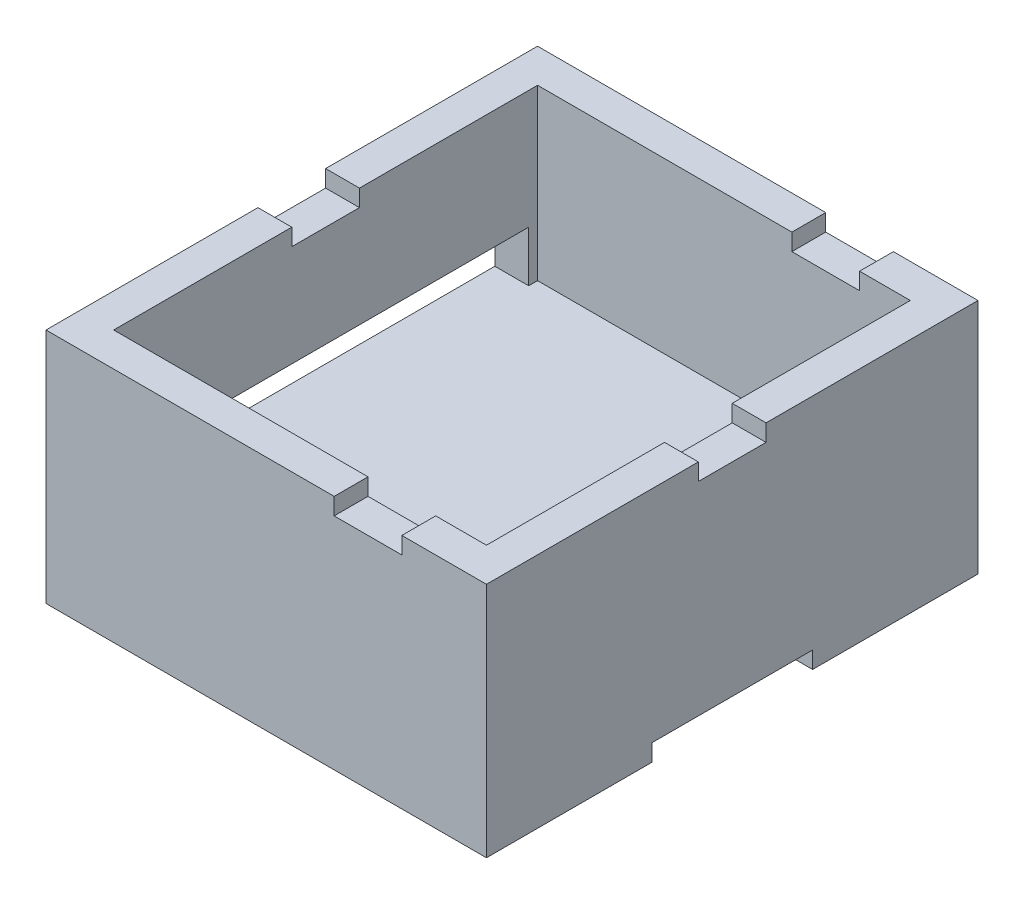
ISO-10303-21;
HEADER;
FILE_DESCRIPTION(('STEP AP214'),'2;1');
FILE_NAME('part.step','',(''),(''),'','','');
FILE_SCHEMA(('AUTOMOTIVE_DESIGN { 1 0 10303 214 1 1 1 1 }'));
ENDSEC;
DATA;
#1=APPLICATION_CONTEXT('core data for automotive mechanical design processes');
#2=APPLICATION_PROTOCOL_DEFINITION('international standard','automotive_design',2000,#1);
#3=PRODUCT_CONTEXT('',#1,'mechanical');
#4=PRODUCT('Part','Part','',(#3));
#5=PRODUCT_RELATED_PRODUCT_CATEGORY('part','',(#4));
#6=PRODUCT_DEFINITION_FORMATION('','',#4);
#7=PRODUCT_DEFINITION_CONTEXT('part definition',#1,'design');
#8=PRODUCT_DEFINITION('design','',#6,#7);
#9=PRODUCT_DEFINITION_SHAPE('','',#8);
#10=(LENGTH_UNIT() NAMED_UNIT(*) SI_UNIT(.MILLI.,.METRE.));
#11=(NAMED_UNIT(*) PLANE_ANGLE_UNIT() SI_UNIT($,.RADIAN.));
#12=(NAMED_UNIT(*) SI_UNIT($,.STERADIAN.) SOLID_ANGLE_UNIT());
#13=UNCERTAINTY_MEASURE_WITH_UNIT(LENGTH_MEASURE(1.E-05),#10,'distance_accuracy_value','');
#14=(GEOMETRIC_REPRESENTATION_CONTEXT(3) GLOBAL_UNCERTAINTY_ASSIGNED_CONTEXT((#13)) GLOBAL_UNIT_ASSIGNED_CONTEXT((#10,
#11,#12)) REPRESENTATION_CONTEXT('',''));
#15=CARTESIAN_POINT('',(0.,0.,0.));
#16=DIRECTION('',(0.,0.,1.));
#17=DIRECTION('',(1.,0.,0.));
#18=AXIS2_PLACEMENT_3D('',#15,#16,#17);
#19=CARTESIAN_POINT('',(0.,0.,0.));
#20=DIRECTION('',(0.,1.,0.));
#21=DIRECTION('',(0.,0.,1.));
#22=AXIS2_PLACEMENT_3D('',#19,#20,#21);
#23=PLANE('',#22);
#24=CARTESIAN_POINT('',(16.53,0.,-2.5));
#25=DIRECTION('',(0.,1.,0.));
#26=DIRECTION('',(0.,0.,1.));
#27=AXIS2_PLACEMENT_3D('',#24,#25,#26);
#28=CIRCLE('',#27,1.5);
#29=CARTESIAN_POINT('',(16.53,0.,-0.999999999999999));
#30=VERTEX_POINT('',#29);
#31=EDGE_CURVE('E497',#30,#30,#28,.T.);
#32=ORIENTED_EDGE('',*,*,#31,.T.);
#33=EDGE_LOOP('',(#32));
#34=FACE_BOUND('',#33,.T.);
#35=DIRECTION('',(0.,0.,-1.));
#36=VECTOR('',#35,1.);
#37=CARTESIAN_POINT('',(-3.5,0.,-25.55));
#38=LINE('',#37,#36);
#39=CARTESIAN_POINT('',(-3.5,0.,3.5));
#40=VERTEX_POINT('',#39);
#41=CARTESIAN_POINT('',(-3.5,0.,-6.275));
#42=VERTEX_POINT('',#41);
#43=EDGE_CURVE('E476',#40,#42,#38,.T.);
#44=ORIENTED_EDGE('',*,*,#43,.T.);
#45=DIRECTION('',(-1.,0.,0.));
#46=VECTOR('',#45,1.);
#47=CARTESIAN_POINT('',(-3.5,0.,-6.275));
#48=LINE('',#47,#46);
#49=CARTESIAN_POINT('',(22.53,0.,-6.275));
#50=VERTEX_POINT('',#49);
#51=EDGE_CURVE('E265',#50,#42,#48,.T.);
#52=ORIENTED_EDGE('',*,*,#51,.F.);
#53=DIRECTION('',(0.,0.,1.));
#54=VECTOR('',#53,1.);
#55=CARTESIAN_POINT('',(22.53,0.,3.5));
#56=LINE('',#55,#54);
#57=CARTESIAN_POINT('',(22.53,0.,3.5));
#58=VERTEX_POINT('',#57);
#59=EDGE_CURVE('E467',#50,#58,#56,.T.);
#60=ORIENTED_EDGE('',*,*,#59,.T.);
#61=DIRECTION('',(-1.,0.,0.));
#62=VECTOR('',#61,1.);
#63=CARTESIAN_POINT('',(-3.5,0.,3.5));
#64=LINE('',#63,#62);
#65=EDGE_CURVE('E472',#58,#40,#64,.T.);
#66=ORIENTED_EDGE('',*,*,#65,.T.);
#67=EDGE_LOOP('',(#44,#52,#60,#66));
#68=FACE_BOUND('',#67,.T.);
#69=ADVANCED_FACE('F38',(#34,#68),#23,.F.);
#70=CARTESIAN_POINT('',(0.,14.,0.));
#71=DIRECTION('',(0.,1.,0.));
#72=DIRECTION('',(0.,0.,1.));
#73=AXIS2_PLACEMENT_3D('',#70,#71,#72);
#74=PLANE('',#73);
#75=DIRECTION('',(0.,0.,-1.));
#76=VECTOR('',#75,1.);
#77=CARTESIAN_POINT('',(17.5299999999999,14.,24.45));
#78=LINE('',#77,#76);
#79=CARTESIAN_POINT('',(17.53,14.,3.5));
#80=VERTEX_POINT('',#79);
#81=CARTESIAN_POINT('',(17.53,14.,1.5));
#82=VERTEX_POINT('',#81);
#83=EDGE_CURVE('E297',#80,#82,#78,.T.);
#84=ORIENTED_EDGE('',*,*,#83,.F.);
#85=DIRECTION('',(-1.,0.,0.));
#86=VECTOR('',#85,1.);
#87=CARTESIAN_POINT('',(-3.5,14.,3.5));
#88=LINE('',#87,#86);
#89=CARTESIAN_POINT('',(22.53,14.,3.5));
#90=VERTEX_POINT('',#89);
#91=EDGE_CURVE('E454',#90,#80,#88,.T.);
#92=ORIENTED_EDGE('',*,*,#91,.F.);
#93=DIRECTION('',(0.,0.,1.));
#94=VECTOR('',#93,1.);
#95=CARTESIAN_POINT('',(22.53,14.,3.5));
#96=LINE('',#95,#94);
#97=CARTESIAN_POINT('',(22.53,14.,-9.025));
#98=VERTEX_POINT('',#97);
#99=EDGE_CURVE('E447',#98,#90,#96,.T.);
#100=ORIENTED_EDGE('',*,*,#99,.F.);
#101=DIRECTION('',(-1.,0.,0.));
#102=VECTOR('',#101,1.);
#103=CARTESIAN_POINT('',(46.5,14.,-9.025));
#104=LINE('',#103,#102);
#105=CARTESIAN_POINT('',(20.53,14.,-9.025));
#106=VERTEX_POINT('',#105);
#107=EDGE_CURVE('E346',#98,#106,#104,.T.);
#108=ORIENTED_EDGE('',*,*,#107,.T.);
#109=DIRECTION('',(0.,0.,1.));
#110=VECTOR('',#109,1.);
#111=CARTESIAN_POINT('',(20.53,14.,1.5));
#112=LINE('',#111,#110);
#113=CARTESIAN_POINT('',(20.53,14.,1.5));
#114=VERTEX_POINT('',#113);
#115=EDGE_CURVE('E417',#106,#114,#112,.T.);
#116=ORIENTED_EDGE('',*,*,#115,.T.);
#117=DIRECTION('',(-1.,0.,0.));
#118=VECTOR('',#117,1.);
#119=CARTESIAN_POINT('',(-1.5,14.,1.5));
#120=LINE('',#119,#118);
#121=EDGE_CURVE('E423',#114,#82,#120,.T.);
#122=ORIENTED_EDGE('',*,*,#121,.T.);
#123=EDGE_LOOP('',(#84,#92,#100,#108,#116,#122));
#124=FACE_BOUND('',#123,.T.);
#125=ADVANCED_FACE('F667',(#124),#74,.T.);
#126=CARTESIAN_POINT('',(17.53,14.,-23.55));
#127=VERTEX_POINT('',#126);
#128=CARTESIAN_POINT('',(17.53,14.,-25.55));
#129=VERTEX_POINT('',#128);
#130=EDGE_CURVE('E294',#127,#129,#78,.T.);
#131=ORIENTED_EDGE('',*,*,#130,.F.);
#132=DIRECTION('',(1.,0.,0.));
#133=VECTOR('',#132,1.);
#134=CARTESIAN_POINT('',(20.53,14.,-23.55));
#135=LINE('',#134,#133);
#136=CARTESIAN_POINT('',(20.53,14.,-23.55));
#137=VERTEX_POINT('',#136);
#138=EDGE_CURVE('E412',#127,#137,#135,.T.);
#139=ORIENTED_EDGE('',*,*,#138,.T.);
#140=CARTESIAN_POINT('',(20.53,14.,-13.025));
#141=VERTEX_POINT('',#140);
#142=EDGE_CURVE('E418',#137,#141,#112,.T.);
#143=ORIENTED_EDGE('',*,*,#142,.T.);
#144=DIRECTION('',(-1.,0.,0.));
#145=VECTOR('',#144,1.);
#146=CARTESIAN_POINT('',(46.5,14.,-13.025));
#147=LINE('',#146,#145);
#148=CARTESIAN_POINT('',(22.53,14.,-13.025));
#149=VERTEX_POINT('',#148);
#150=EDGE_CURVE('E355',#149,#141,#147,.T.);
#151=ORIENTED_EDGE('',*,*,#150,.F.);
#152=CARTESIAN_POINT('',(22.53,14.,-25.55));
#153=VERTEX_POINT('',#152);
#154=EDGE_CURVE('E449',#153,#149,#96,.T.);
#155=ORIENTED_EDGE('',*,*,#154,.F.);
#156=DIRECTION('',(1.,0.,0.));
#157=VECTOR('',#156,1.);
#158=CARTESIAN_POINT('',(22.53,14.,-25.55));
#159=LINE('',#158,#157);
#160=EDGE_CURVE('E448',#129,#153,#159,.T.);
#161=ORIENTED_EDGE('',*,*,#160,.F.);
#162=EDGE_LOOP('',(#131,#139,#143,#151,#155,#161));
#163=FACE_BOUND('',#162,.T.);
#164=ADVANCED_FACE('F652',(#163),#74,.T.);
#165=DIRECTION('',(0.,0.,-1.));
#166=VECTOR('',#165,1.);
#167=CARTESIAN_POINT('',(13.5299999999999,14.,24.45));
#168=LINE('',#167,#166);
#169=CARTESIAN_POINT('',(13.53,14.,3.5));
#170=VERTEX_POINT('',#169);
#171=CARTESIAN_POINT('',(13.53,14.,1.5));
#172=VERTEX_POINT('',#171);
#173=EDGE_CURVE('E298',#170,#172,#168,.T.);
#174=ORIENTED_EDGE('',*,*,#173,.T.);
#175=CARTESIAN_POINT('',(-1.5,14.,1.5));
#176=VERTEX_POINT('',#175);
#177=EDGE_CURVE('E422',#172,#176,#120,.T.);
#178=ORIENTED_EDGE('',*,*,#177,.T.);
#179=DIRECTION('',(0.,0.,-1.));
#180=VECTOR('',#179,1.);
#181=CARTESIAN_POINT('',(-1.5,14.,-23.55));
#182=LINE('',#181,#180);
#183=CARTESIAN_POINT('',(-1.5,14.,-9.025));
#184=VERTEX_POINT('',#183);
#185=EDGE_CURVE('E408',#176,#184,#182,.T.);
#186=ORIENTED_EDGE('',*,*,#185,.T.);
#187=CARTESIAN_POINT('',(-3.5,14.,-9.025));
#188=VERTEX_POINT('',#187);
#189=EDGE_CURVE('E342',#184,#188,#104,.T.);
#190=ORIENTED_EDGE('',*,*,#189,.T.);
#191=DIRECTION('',(0.,0.,-1.));
#192=VECTOR('',#191,1.);
#193=CARTESIAN_POINT('',(-3.5,14.,-25.55));
#194=LINE('',#193,#192);
#195=CARTESIAN_POINT('',(-3.5,14.,3.5));
#196=VERTEX_POINT('',#195);
#197=EDGE_CURVE('E459',#196,#188,#194,.T.);
#198=ORIENTED_EDGE('',*,*,#197,.F.);
#199=EDGE_CURVE('E453',#170,#196,#88,.T.);
#200=ORIENTED_EDGE('',*,*,#199,.F.);
#201=EDGE_LOOP('',(#174,#178,#186,#190,#198,#200));
#202=FACE_BOUND('',#201,.T.);
#203=ADVANCED_FACE('F591',(#202),#74,.T.);
#204=CARTESIAN_POINT('',(0.,4.,0.));
#205=DIRECTION('',(0.,1.,0.));
#206=DIRECTION('',(0.,0.,1.));
#207=AXIS2_PLACEMENT_3D('',#204,#205,#206);
#208=PLANE('',#207);
#209=DIRECTION('',(0.,0.,1.));
#210=VECTOR('',#209,1.);
#211=CARTESIAN_POINT('',(-1.5,4.,-23.55));
#212=LINE('',#211,#210);
#213=CARTESIAN_POINT('',(-1.5,4.,-23.55));
#214=VERTEX_POINT('',#213);
#215=CARTESIAN_POINT('',(-1.5,4.,-23.025));
#216=VERTEX_POINT('',#215);
#217=EDGE_CURVE('E517',#214,#216,#212,.T.);
#218=ORIENTED_EDGE('',*,*,#217,.T.);
#219=DIRECTION('',(-1.,0.,0.));
#220=VECTOR('',#219,1.);
#221=CARTESIAN_POINT('',(1.5,4.,-23.025));
#222=LINE('',#221,#220);
#223=CARTESIAN_POINT('',(-3.5,4.,-23.025));
#224=VERTEX_POINT('',#223);
#225=EDGE_CURVE('E395',#216,#224,#222,.T.);
#226=ORIENTED_EDGE('',*,*,#225,.T.);
#227=DIRECTION('',(0.,0.,1.));
#228=VECTOR('',#227,1.);
#229=CARTESIAN_POINT('',(-3.5,4.,-11.025));
#230=LINE('',#229,#228);
#231=CARTESIAN_POINT('',(-3.5,4.,0.974999999999997));
#232=VERTEX_POINT('',#231);
#233=EDGE_CURVE('E391',#224,#232,#230,.T.);
#234=ORIENTED_EDGE('',*,*,#233,.T.);
#235=DIRECTION('',(-1.,0.,0.));
#236=VECTOR('',#235,1.);
#237=CARTESIAN_POINT('',(1.5,4.,0.974999999999998));
#238=LINE('',#237,#236);
#239=CARTESIAN_POINT('',(-1.5,4.,0.974999999999998));
#240=VERTEX_POINT('',#239);
#241=EDGE_CURVE('E394',#240,#232,#238,.T.);
#242=ORIENTED_EDGE('',*,*,#241,.F.);
#243=CARTESIAN_POINT('',(-1.5,4.,1.5));
#244=VERTEX_POINT('',#243);
#245=EDGE_CURVE('E516',#240,#244,#212,.T.);
#246=ORIENTED_EDGE('',*,*,#245,.T.);
#247=DIRECTION('',(1.,0.,0.));
#248=VECTOR('',#247,1.);
#249=CARTESIAN_POINT('',(-1.5,4.,1.5));
#250=LINE('',#249,#248);
#251=CARTESIAN_POINT('',(20.53,4.,1.5));
#252=VERTEX_POINT('',#251);
#253=EDGE_CURVE('E521',#244,#252,#250,.T.);
#254=ORIENTED_EDGE('',*,*,#253,.T.);
#255=DIRECTION('',(0.,0.,-1.));
#256=VECTOR('',#255,1.);
#257=CARTESIAN_POINT('',(20.53,4.,1.5));
#258=LINE('',#257,#256);
#259=CARTESIAN_POINT('',(20.53,4.,-23.55));
#260=VERTEX_POINT('',#259);
#261=EDGE_CURVE('E505',#252,#260,#258,.T.);
#262=ORIENTED_EDGE('',*,*,#261,.T.);
#263=DIRECTION('',(-1.,0.,0.));
#264=VECTOR('',#263,1.);
#265=CARTESIAN_POINT('',(20.53,4.,-23.55));
#266=LINE('',#265,#264);
#267=EDGE_CURVE('E512',#260,#214,#266,.T.);
#268=ORIENTED_EDGE('',*,*,#267,.T.);
#269=EDGE_LOOP('',(#218,#226,#234,#242,#246,#254,#262,#268));
#270=FACE_BOUND('',#269,.T.);
#271=CARTESIAN_POINT('',(16.53,4.,-2.5));
#272=DIRECTION('',(0.,1.,0.));
#273=DIRECTION('',(0.,0.,1.));
#274=AXIS2_PLACEMENT_3D('',#271,#272,#273);
#275=CIRCLE('',#274,1.5);
#276=CARTESIAN_POINT('',(16.53,4.,-0.999999999999999));
#277=VERTEX_POINT('',#276);
#278=EDGE_CURVE('E501',#277,#277,#275,.T.);
#279=ORIENTED_EDGE('',*,*,#278,.F.);
#280=EDGE_LOOP('',(#279));
#281=FACE_BOUND('',#280,.T.);
#282=CARTESIAN_POINT('',(16.53,4.,-19.55));
#283=DIRECTION('',(0.,1.,0.));
#284=DIRECTION('',(0.,0.,1.));
#285=AXIS2_PLACEMENT_3D('',#282,#283,#284);
#286=CIRCLE('',#285,1.5);
#287=CARTESIAN_POINT('',(16.53,4.,-18.05));
#288=VERTEX_POINT('',#287);
#289=EDGE_CURVE('E493',#288,#288,#286,.T.);
#290=ORIENTED_EDGE('',*,*,#289,.F.);
#291=EDGE_LOOP('',(#290));
#292=FACE_BOUND('',#291,.T.);
#293=ADVANCED_FACE('F578',(#270,#281,#292),#208,.T.);
#294=CARTESIAN_POINT('',(16.53,0.,-19.55));
#295=DIRECTION('',(0.,1.,0.));
#296=DIRECTION('',(0.,0.,1.));
#297=AXIS2_PLACEMENT_3D('',#294,#295,#296);
#298=CIRCLE('',#297,1.5);
#299=CARTESIAN_POINT('',(16.53,0.,-18.05));
#300=VERTEX_POINT('',#299);
#301=EDGE_CURVE('E483',#300,#300,#298,.T.);
#302=ORIENTED_EDGE('',*,*,#301,.T.);
#303=EDGE_LOOP('',(#302));
#304=FACE_BOUND('',#303,.T.);
#305=CARTESIAN_POINT('',(22.53,0.,-25.55));
#306=VERTEX_POINT('',#305);
#307=CARTESIAN_POINT('',(22.53,0.,-15.775));
#308=VERTEX_POINT('',#307);
#309=EDGE_CURVE('E468',#306,#308,#56,.T.);
#310=ORIENTED_EDGE('',*,*,#309,.T.);
#311=DIRECTION('',(1.,0.,0.));
#312=VECTOR('',#311,1.);
#313=CARTESIAN_POINT('',(22.53,0.,-15.775));
#314=LINE('',#313,#312);
#315=CARTESIAN_POINT('',(-3.5,0.,-15.775));
#316=VERTEX_POINT('',#315);
#317=EDGE_CURVE('E618',#316,#308,#314,.T.);
#318=ORIENTED_EDGE('',*,*,#317,.F.);
#319=CARTESIAN_POINT('',(-3.5,0.,-25.55));
#320=VERTEX_POINT('',#319);
#321=EDGE_CURVE('E271',#316,#320,#38,.T.);
#322=ORIENTED_EDGE('',*,*,#321,.T.);
#323=DIRECTION('',(1.,0.,0.));
#324=VECTOR('',#323,1.);
#325=CARTESIAN_POINT('',(22.53,0.,-25.55));
#326=LINE('',#325,#324);
#327=EDGE_CURVE('E432',#320,#306,#326,.T.);
#328=ORIENTED_EDGE('',*,*,#327,.T.);
#329=EDGE_LOOP('',(#310,#318,#322,#328));
#330=FACE_BOUND('',#329,.T.);
#331=ADVANCED_FACE('F40',(#304,#330),#23,.F.);
#332=CARTESIAN_POINT('',(16.53,4.,-2.5));
#333=DIRECTION('',(0.,-1.,0.));
#334=DIRECTION('',(0.,0.,-1.));
#335=AXIS2_PLACEMENT_3D('',#332,#333,#334);
#336=CYLINDRICAL_SURFACE('',#335,1.5);
#337=ORIENTED_EDGE('',*,*,#278,.T.);
#338=EDGE_LOOP('',(#337));
#339=FACE_BOUND('',#338,.T.);
#340=ORIENTED_EDGE('',*,*,#31,.F.);
#341=EDGE_LOOP('',(#340));
#342=FACE_BOUND('',#341,.T.);
#343=ADVANCED_FACE('F696',(#339,#342),#336,.F.);
#344=CARTESIAN_POINT('',(16.53,4.,-19.55));
#345=DIRECTION('',(0.,-1.,0.));
#346=DIRECTION('',(0.,0.,-1.));
#347=AXIS2_PLACEMENT_3D('',#344,#345,#346);
#348=CYLINDRICAL_SURFACE('',#347,1.5);
#349=ORIENTED_EDGE('',*,*,#289,.T.);
#350=EDGE_LOOP('',(#349));
#351=FACE_BOUND('',#350,.T.);
#352=ORIENTED_EDGE('',*,*,#301,.F.);
#353=EDGE_LOOP('',(#352));
#354=FACE_BOUND('',#353,.T.);
#355=ADVANCED_FACE('F702',(#351,#354),#348,.F.);
#356=CARTESIAN_POINT('',(22.53,14.,-25.55));
#357=DIRECTION('',(0.,0.,-1.));
#358=DIRECTION('',(-1.,0.,0.));
#359=AXIS2_PLACEMENT_3D('',#356,#357,#358);
#360=PLANE('',#359);
#361=DIRECTION('',(0.,-1.,0.));
#362=VECTOR('',#361,1.);
#363=CARTESIAN_POINT('',(17.53,13.,-25.55));
#364=LINE('',#363,#362);
#365=CARTESIAN_POINT('',(17.53,13.,-25.55));
#366=VERTEX_POINT('',#365);
#367=EDGE_CURVE('E281',#129,#366,#364,.T.);
#368=ORIENTED_EDGE('',*,*,#367,.F.);
#369=ORIENTED_EDGE('',*,*,#160,.T.);
#370=DIRECTION('',(0.,-1.,0.));
#371=VECTOR('',#370,1.);
#372=CARTESIAN_POINT('',(22.53,14.,-25.55));
#373=LINE('',#372,#371);
#374=EDGE_CURVE('E463',#153,#306,#373,.T.);
#375=ORIENTED_EDGE('',*,*,#374,.T.);
#376=ORIENTED_EDGE('',*,*,#327,.F.);
#377=DIRECTION('',(0.,-1.,0.));
#378=VECTOR('',#377,1.);
#379=CARTESIAN_POINT('',(-3.5,14.,-25.55));
#380=LINE('',#379,#378);
#381=CARTESIAN_POINT('',(-3.5,14.,-25.55));
#382=VERTEX_POINT('',#381);
#383=EDGE_CURVE('E480',#382,#320,#380,.T.);
#384=ORIENTED_EDGE('',*,*,#383,.F.);
#385=CARTESIAN_POINT('',(13.53,14.,-25.55));
#386=VERTEX_POINT('',#385);
#387=EDGE_CURVE('E443',#382,#386,#159,.T.);
#388=ORIENTED_EDGE('',*,*,#387,.T.);
#389=DIRECTION('',(0.,1.,0.));
#390=VECTOR('',#389,1.);
#391=CARTESIAN_POINT('',(13.53,14.,-25.55));
#392=LINE('',#391,#390);
#393=CARTESIAN_POINT('',(13.53,13.,-25.55));
#394=VERTEX_POINT('',#393);
#395=EDGE_CURVE('E290',#394,#386,#392,.T.);
#396=ORIENTED_EDGE('',*,*,#395,.F.);
#397=DIRECTION('',(-1.,0.,0.));
#398=VECTOR('',#397,1.);
#399=CARTESIAN_POINT('',(13.53,13.,-25.55));
#400=LINE('',#399,#398);
#401=EDGE_CURVE('E285',#366,#394,#400,.T.);
#402=ORIENTED_EDGE('',*,*,#401,.F.);
#403=EDGE_LOOP('',(#368,#369,#375,#376,#384,#388,#396,#402));
#404=FACE_BOUND('',#403,.T.);
#405=ADVANCED_FACE('F641',(#404),#360,.T.);
#406=CARTESIAN_POINT('',(-3.5,14.,-25.55));
#407=DIRECTION('',(-1.,0.,0.));
#408=DIRECTION('',(0.,0.,1.));
#409=AXIS2_PLACEMENT_3D('',#406,#407,#408);
#410=PLANE('',#409);
#411=DIRECTION('',(0.,-1.,0.));
#412=VECTOR('',#411,1.);
#413=CARTESIAN_POINT('',(-3.5,1.,-6.275));
#414=LINE('',#413,#412);
#415=CARTESIAN_POINT('',(-3.5,1.,-6.275));
#416=VERTEX_POINT('',#415);
#417=EDGE_CURVE('E286',#416,#42,#414,.T.);
#418=ORIENTED_EDGE('',*,*,#417,.T.);
#419=ORIENTED_EDGE('',*,*,#43,.F.);
#420=DIRECTION('',(0.,-1.,0.));
#421=VECTOR('',#420,1.);
#422=CARTESIAN_POINT('',(-3.5,14.,3.5));
#423=LINE('',#422,#421);
#424=EDGE_CURVE('E484',#196,#40,#423,.T.);
#425=ORIENTED_EDGE('',*,*,#424,.F.);
#426=ORIENTED_EDGE('',*,*,#197,.T.);
#427=DIRECTION('',(0.,1.,0.));
#428=VECTOR('',#427,1.);
#429=CARTESIAN_POINT('',(-3.5,13.,-9.025));
#430=LINE('',#429,#428);
#431=CARTESIAN_POINT('',(-3.5,13.,-9.025));
#432=VERTEX_POINT('',#431);
#433=EDGE_CURVE('E338',#432,#188,#430,.T.);
#434=ORIENTED_EDGE('',*,*,#433,.F.);
#435=DIRECTION('',(0.,0.,1.));
#436=VECTOR('',#435,1.);
#437=CARTESIAN_POINT('',(-3.5,13.,-13.025));
#438=LINE('',#437,#436);
#439=CARTESIAN_POINT('',(-3.5,13.,-13.025));
#440=VERTEX_POINT('',#439);
#441=EDGE_CURVE('E334',#440,#432,#438,.T.);
#442=ORIENTED_EDGE('',*,*,#441,.F.);
#443=DIRECTION('',(0.,-1.,0.));
#444=VECTOR('',#443,1.);
#445=CARTESIAN_POINT('',(-3.5,14.,-13.025));
#446=LINE('',#445,#444);
#447=CARTESIAN_POINT('',(-3.5,14.,-13.025));
#448=VERTEX_POINT('',#447);
#449=EDGE_CURVE('E330',#448,#440,#446,.T.);
#450=ORIENTED_EDGE('',*,*,#449,.F.);
#451=EDGE_CURVE('E458',#448,#382,#194,.T.);
#452=ORIENTED_EDGE('',*,*,#451,.T.);
#453=ORIENTED_EDGE('',*,*,#383,.T.);
#454=ORIENTED_EDGE('',*,*,#321,.F.);
#455=DIRECTION('',(0.,-1.,0.));
#456=VECTOR('',#455,1.);
#457=CARTESIAN_POINT('',(-3.5,1.,-15.775));
#458=LINE('',#457,#456);
#459=CARTESIAN_POINT('',(-3.5,1.,-15.775));
#460=VERTEX_POINT('',#459);
#461=EDGE_CURVE('E249',#460,#316,#458,.T.);
#462=ORIENTED_EDGE('',*,*,#461,.F.);
#463=DIRECTION('',(0.,0.,-1.));
#464=VECTOR('',#463,1.);
#465=CARTESIAN_POINT('',(-3.5,1.,-11.025));
#466=LINE('',#465,#464);
#467=EDGE_CURVE('E256',#416,#460,#466,.T.);
#468=ORIENTED_EDGE('',*,*,#467,.F.);
#469=EDGE_LOOP('',(#418,#419,#425,#426,#434,#442,#450,#452,#453,#454,#462,#468));
#470=FACE_BOUND('',#469,.T.);
#471=ORIENTED_EDGE('',*,*,#233,.F.);
#472=DIRECTION('',(0.,-1.,0.));
#473=VECTOR('',#472,1.);
#474=CARTESIAN_POINT('',(-3.5,4.,-23.025));
#475=LINE('',#474,#473);
#476=CARTESIAN_POINT('',(-3.5,7.,-23.025));
#477=VERTEX_POINT('',#476);
#478=EDGE_CURVE('E387',#477,#224,#475,.T.);
#479=ORIENTED_EDGE('',*,*,#478,.F.);
#480=DIRECTION('',(0.,0.,-1.));
#481=VECTOR('',#480,1.);
#482=CARTESIAN_POINT('',(-3.5,7.,-23.025));
#483=LINE('',#482,#481);
#484=CARTESIAN_POINT('',(-3.5,7.,0.974999999999998));
#485=VERTEX_POINT('',#484);
#486=EDGE_CURVE('E383',#485,#477,#483,.T.);
#487=ORIENTED_EDGE('',*,*,#486,.F.);
#488=DIRECTION('',(0.,1.,0.));
#489=VECTOR('',#488,1.);
#490=CARTESIAN_POINT('',(-3.5,7.,0.974999999999998));
#491=LINE('',#490,#489);
#492=EDGE_CURVE('E379',#232,#485,#491,.T.);
#493=ORIENTED_EDGE('',*,*,#492,.F.);
#494=EDGE_LOOP('',(#471,#479,#487,#493));
#495=FACE_BOUND('',#494,.T.);
#496=ADVANCED_FACE('F268',(#470,#495),#410,.T.);
#497=CARTESIAN_POINT('',(-3.5,14.,3.5));
#498=DIRECTION('',(0.,0.,1.));
#499=DIRECTION('',(1.,0.,0.));
#500=AXIS2_PLACEMENT_3D('',#497,#498,#499);
#501=PLANE('',#500);
#502=DIRECTION('',(0.,1.,0.));
#503=VECTOR('',#502,1.);
#504=CARTESIAN_POINT('',(17.53,14.,3.5));
#505=LINE('',#504,#503);
#506=CARTESIAN_POINT('',(17.53,13.,3.5));
#507=VERTEX_POINT('',#506);
#508=EDGE_CURVE('E327',#507,#80,#505,.T.);
#509=ORIENTED_EDGE('',*,*,#508,.F.);
#510=DIRECTION('',(1.,0.,0.));
#511=VECTOR('',#510,1.);
#512=CARTESIAN_POINT('',(-3.5,13.,3.5));
#513=LINE('',#512,#511);
#514=CARTESIAN_POINT('',(13.53,13.,3.5));
#515=VERTEX_POINT('',#514);
#516=EDGE_CURVE('E313',#515,#507,#513,.T.);
#517=ORIENTED_EDGE('',*,*,#516,.F.);
#518=DIRECTION('',(0.,-1.,0.));
#519=VECTOR('',#518,1.);
#520=CARTESIAN_POINT('',(13.53,14.,3.5));
#521=LINE('',#520,#519);
#522=EDGE_CURVE('E320',#170,#515,#521,.T.);
#523=ORIENTED_EDGE('',*,*,#522,.F.);
#524=ORIENTED_EDGE('',*,*,#199,.T.);
#525=ORIENTED_EDGE('',*,*,#424,.T.);
#526=ORIENTED_EDGE('',*,*,#65,.F.);
#527=DIRECTION('',(0.,-1.,0.));
#528=VECTOR('',#527,1.);
#529=CARTESIAN_POINT('',(22.53,14.,3.5));
#530=LINE('',#529,#528);
#531=EDGE_CURVE('E487',#90,#58,#530,.T.);
#532=ORIENTED_EDGE('',*,*,#531,.F.);
#533=ORIENTED_EDGE('',*,*,#91,.T.);
#534=EDGE_LOOP('',(#509,#517,#523,#524,#525,#526,#532,#533));
#535=FACE_BOUND('',#534,.T.);
#536=ADVANCED_FACE('F670',(#535),#501,.T.);
#537=CARTESIAN_POINT('',(22.53,14.,3.5));
#538=DIRECTION('',(1.,0.,0.));
#539=DIRECTION('',(0.,0.,-1.));
#540=AXIS2_PLACEMENT_3D('',#537,#538,#539);
#541=PLANE('',#540);
#542=DIRECTION('',(0.,-1.,0.));
#543=VECTOR('',#542,1.);
#544=CARTESIAN_POINT('',(22.53,1.,-6.275));
#545=LINE('',#544,#543);
#546=CARTESIAN_POINT('',(22.53,1.,-6.275));
#547=VERTEX_POINT('',#546);
#548=EDGE_CURVE('E276',#547,#50,#545,.T.);
#549=ORIENTED_EDGE('',*,*,#548,.F.);
#550=DIRECTION('',(0.,0.,1.));
#551=VECTOR('',#550,1.);
#552=CARTESIAN_POINT('',(22.53,1.,-6.275));
#553=LINE('',#552,#551);
#554=CARTESIAN_POINT('',(22.53,0.999999999999999,-15.775));
#555=VERTEX_POINT('',#554);
#556=EDGE_CURVE('E255',#555,#547,#553,.T.);
#557=ORIENTED_EDGE('',*,*,#556,.F.);
#558=DIRECTION('',(0.,-1.,0.));
#559=VECTOR('',#558,1.);
#560=CARTESIAN_POINT('',(22.53,1.,-15.775));
#561=LINE('',#560,#559);
#562=EDGE_CURVE('E252',#555,#308,#561,.T.);
#563=ORIENTED_EDGE('',*,*,#562,.T.);
#564=ORIENTED_EDGE('',*,*,#309,.F.);
#565=ORIENTED_EDGE('',*,*,#374,.F.);
#566=ORIENTED_EDGE('',*,*,#154,.T.);
#567=DIRECTION('',(0.,1.,0.));
#568=VECTOR('',#567,1.);
#569=CARTESIAN_POINT('',(22.53,14.,-13.025));
#570=LINE('',#569,#568);
#571=CARTESIAN_POINT('',(22.53,13.,-13.025));
#572=VERTEX_POINT('',#571);
#573=EDGE_CURVE('E362',#572,#149,#570,.T.);
#574=ORIENTED_EDGE('',*,*,#573,.F.);
#575=DIRECTION('',(0.,0.,-1.));
#576=VECTOR('',#575,1.);
#577=CARTESIAN_POINT('',(22.53,13.,3.5));
#578=LINE('',#577,#576);
#579=CARTESIAN_POINT('',(22.53,13.,-9.025));
#580=VERTEX_POINT('',#579);
#581=EDGE_CURVE('E369',#580,#572,#578,.T.);
#582=ORIENTED_EDGE('',*,*,#581,.F.);
#583=DIRECTION('',(0.,-1.,0.));
#584=VECTOR('',#583,1.);
#585=CARTESIAN_POINT('',(22.53,14.,-9.025));
#586=LINE('',#585,#584);
#587=EDGE_CURVE('E376',#98,#580,#586,.T.);
#588=ORIENTED_EDGE('',*,*,#587,.F.);
#589=ORIENTED_EDGE('',*,*,#99,.T.);
#590=ORIENTED_EDGE('',*,*,#531,.T.);
#591=ORIENTED_EDGE('',*,*,#59,.F.);
#592=EDGE_LOOP('',(#549,#557,#563,#564,#565,#566,#574,#582,#588,#589,#590,#591));
#593=FACE_BOUND('',#592,.T.);
#594=ADVANCED_FACE('F624',(#593),#541,.T.);
#595=CARTESIAN_POINT('',(13.53,14.,-23.55));
#596=VERTEX_POINT('',#595);
#597=EDGE_CURVE('E299',#596,#386,#168,.T.);
#598=ORIENTED_EDGE('',*,*,#597,.T.);
#599=ORIENTED_EDGE('',*,*,#387,.F.);
#600=ORIENTED_EDGE('',*,*,#451,.F.);
#601=CARTESIAN_POINT('',(-1.5,14.,-13.025));
#602=VERTEX_POINT('',#601);
#603=EDGE_CURVE('E341',#602,#448,#147,.T.);
#604=ORIENTED_EDGE('',*,*,#603,.F.);
#605=CARTESIAN_POINT('',(-1.5,14.,-23.55));
#606=VERTEX_POINT('',#605);
#607=EDGE_CURVE('E398',#602,#606,#182,.T.);
#608=ORIENTED_EDGE('',*,*,#607,.T.);
#609=EDGE_CURVE('E413',#606,#596,#135,.T.);
#610=ORIENTED_EDGE('',*,*,#609,.T.);
#611=EDGE_LOOP('',(#598,#599,#600,#604,#608,#610));
#612=FACE_BOUND('',#611,.T.);
#613=ADVANCED_FACE('F561',(#612),#74,.T.);
#614=CARTESIAN_POINT('',(-1.5,14.,-23.55));
#615=DIRECTION('',(-1.,0.,0.));
#616=DIRECTION('',(0.,0.,1.));
#617=AXIS2_PLACEMENT_3D('',#614,#615,#616);
#618=PLANE('',#617);
#619=DIRECTION('',(0.,0.,1.));
#620=VECTOR('',#619,1.);
#621=CARTESIAN_POINT('',(-1.5,13.,-23.55));
#622=LINE('',#621,#620);
#623=CARTESIAN_POINT('',(-1.5,13.,-13.025));
#624=VERTEX_POINT('',#623);
#625=CARTESIAN_POINT('',(-1.5,13.,-9.025));
#626=VERTEX_POINT('',#625);
#627=EDGE_CURVE('E365',#624,#626,#622,.T.);
#628=ORIENTED_EDGE('',*,*,#627,.T.);
#629=DIRECTION('',(0.,1.,0.));
#630=VECTOR('',#629,1.);
#631=CARTESIAN_POINT('',(-1.5,14.,-9.025));
#632=LINE('',#631,#630);
#633=EDGE_CURVE('E372',#626,#184,#632,.T.);
#634=ORIENTED_EDGE('',*,*,#633,.T.);
#635=ORIENTED_EDGE('',*,*,#185,.F.);
#636=DIRECTION('',(0.,-1.,0.));
#637=VECTOR('',#636,1.);
#638=CARTESIAN_POINT('',(-1.5,14.,1.5));
#639=LINE('',#638,#637);
#640=EDGE_CURVE('E428',#176,#244,#639,.T.);
#641=ORIENTED_EDGE('',*,*,#640,.T.);
#642=ORIENTED_EDGE('',*,*,#245,.F.);
#643=DIRECTION('',(0.,1.,0.));
#644=VECTOR('',#643,1.);
#645=CARTESIAN_POINT('',(-1.5,14.,0.974999999999997));
#646=LINE('',#645,#644);
#647=CARTESIAN_POINT('',(-1.5,7.,0.974999999999997));
#648=VERTEX_POINT('',#647);
#649=EDGE_CURVE('E525',#240,#648,#646,.T.);
#650=ORIENTED_EDGE('',*,*,#649,.T.);
#651=DIRECTION('',(0.,0.,-1.));
#652=VECTOR('',#651,1.);
#653=CARTESIAN_POINT('',(-1.5,7.,-23.55));
#654=LINE('',#653,#652);
#655=CARTESIAN_POINT('',(-1.5,7.,-23.025));
#656=VERTEX_POINT('',#655);
#657=EDGE_CURVE('E529',#648,#656,#654,.T.);
#658=ORIENTED_EDGE('',*,*,#657,.T.);
#659=DIRECTION('',(0.,-1.,0.));
#660=VECTOR('',#659,1.);
#661=CARTESIAN_POINT('',(-1.5,14.,-23.025));
#662=LINE('',#661,#660);
#663=EDGE_CURVE('E533',#656,#216,#662,.T.);
#664=ORIENTED_EDGE('',*,*,#663,.T.);
#665=ORIENTED_EDGE('',*,*,#217,.F.);
#666=DIRECTION('',(0.,-1.,0.));
#667=VECTOR('',#666,1.);
#668=CARTESIAN_POINT('',(-1.5,14.,-23.55));
#669=LINE('',#668,#667);
#670=EDGE_CURVE('E427',#606,#214,#669,.T.);
#671=ORIENTED_EDGE('',*,*,#670,.F.);
#672=ORIENTED_EDGE('',*,*,#607,.F.);
#673=DIRECTION('',(0.,-1.,0.));
#674=VECTOR('',#673,1.);
#675=CARTESIAN_POINT('',(-1.5,14.,-13.025));
#676=LINE('',#675,#674);
#677=EDGE_CURVE('E358',#602,#624,#676,.T.);
#678=ORIENTED_EDGE('',*,*,#677,.T.);
#679=EDGE_LOOP('',(#628,#634,#635,#641,#642,#650,#658,#664,#665,#671,#672,#678));
#680=FACE_BOUND('',#679,.T.);
#681=ADVANCED_FACE('F570',(#680),#618,.F.);
#682=CARTESIAN_POINT('',(-1.5,14.,1.5));
#683=DIRECTION('',(0.,0.,1.));
#684=DIRECTION('',(1.,0.,0.));
#685=AXIS2_PLACEMENT_3D('',#682,#683,#684);
#686=PLANE('',#685);
#687=DIRECTION('',(1.,0.,0.));
#688=VECTOR('',#687,1.);
#689=CARTESIAN_POINT('',(-1.5,13.,1.5));
#690=LINE('',#689,#688);
#691=CARTESIAN_POINT('',(13.53,13.,1.5));
#692=VERTEX_POINT('',#691);
#693=CARTESIAN_POINT('',(17.53,13.,1.5));
#694=VERTEX_POINT('',#693);
#695=EDGE_CURVE('E309',#692,#694,#690,.T.);
#696=ORIENTED_EDGE('',*,*,#695,.T.);
#697=DIRECTION('',(0.,1.,0.));
#698=VECTOR('',#697,1.);
#699=CARTESIAN_POINT('',(17.53,14.,1.5));
#700=LINE('',#699,#698);
#701=EDGE_CURVE('E323',#694,#82,#700,.T.);
#702=ORIENTED_EDGE('',*,*,#701,.T.);
#703=ORIENTED_EDGE('',*,*,#121,.F.);
#704=DIRECTION('',(0.,-1.,0.));
#705=VECTOR('',#704,1.);
#706=CARTESIAN_POINT('',(20.53,14.,1.5));
#707=LINE('',#706,#705);
#708=EDGE_CURVE('E433',#114,#252,#707,.T.);
#709=ORIENTED_EDGE('',*,*,#708,.T.);
#710=ORIENTED_EDGE('',*,*,#253,.F.);
#711=ORIENTED_EDGE('',*,*,#640,.F.);
#712=ORIENTED_EDGE('',*,*,#177,.F.);
#713=DIRECTION('',(0.,-1.,0.));
#714=VECTOR('',#713,1.);
#715=CARTESIAN_POINT('',(13.53,14.,1.5));
#716=LINE('',#715,#714);
#717=EDGE_CURVE('E316',#172,#692,#716,.T.);
#718=ORIENTED_EDGE('',*,*,#717,.T.);
#719=EDGE_LOOP('',(#696,#702,#703,#709,#710,#711,#712,#718));
#720=FACE_BOUND('',#719,.T.);
#721=ADVANCED_FACE('F585',(#720),#686,.F.);
#722=CARTESIAN_POINT('',(20.53,14.,1.5));
#723=DIRECTION('',(1.,0.,0.));
#724=DIRECTION('',(0.,0.,-1.));
#725=AXIS2_PLACEMENT_3D('',#722,#723,#724);
#726=PLANE('',#725);
#727=ORIENTED_EDGE('',*,*,#115,.F.);
#728=DIRECTION('',(0.,-1.,0.));
#729=VECTOR('',#728,1.);
#730=CARTESIAN_POINT('',(20.53,14.,-9.025));
#731=LINE('',#730,#729);
#732=CARTESIAN_POINT('',(20.53,13.,-9.025));
#733=VERTEX_POINT('',#732);
#734=EDGE_CURVE('E545',#106,#733,#731,.T.);
#735=ORIENTED_EDGE('',*,*,#734,.T.);
#736=DIRECTION('',(0.,0.,-1.));
#737=VECTOR('',#736,1.);
#738=CARTESIAN_POINT('',(20.53,13.,1.5));
#739=LINE('',#738,#737);
#740=CARTESIAN_POINT('',(20.53,13.,-13.025));
#741=VERTEX_POINT('',#740);
#742=EDGE_CURVE('E541',#733,#741,#739,.T.);
#743=ORIENTED_EDGE('',*,*,#742,.T.);
#744=DIRECTION('',(0.,1.,0.));
#745=VECTOR('',#744,1.);
#746=CARTESIAN_POINT('',(20.53,14.,-13.025));
#747=LINE('',#746,#745);
#748=EDGE_CURVE('E537',#741,#141,#747,.T.);
#749=ORIENTED_EDGE('',*,*,#748,.T.);
#750=ORIENTED_EDGE('',*,*,#142,.F.);
#751=DIRECTION('',(0.,-1.,0.));
#752=VECTOR('',#751,1.);
#753=CARTESIAN_POINT('',(20.53,14.,-23.55));
#754=LINE('',#753,#752);
#755=EDGE_CURVE('E437',#137,#260,#754,.T.);
#756=ORIENTED_EDGE('',*,*,#755,.T.);
#757=ORIENTED_EDGE('',*,*,#261,.F.);
#758=ORIENTED_EDGE('',*,*,#708,.F.);
#759=EDGE_LOOP('',(#727,#735,#743,#749,#750,#756,#757,#758));
#760=FACE_BOUND('',#759,.T.);
#761=ADVANCED_FACE('F576',(#760),#726,.F.);
#762=CARTESIAN_POINT('',(20.53,14.,-23.55));
#763=DIRECTION('',(0.,0.,-1.));
#764=DIRECTION('',(-1.,0.,0.));
#765=AXIS2_PLACEMENT_3D('',#762,#763,#764);
#766=PLANE('',#765);
#767=ORIENTED_EDGE('',*,*,#138,.F.);
#768=DIRECTION('',(0.,-1.,0.));
#769=VECTOR('',#768,1.);
#770=CARTESIAN_POINT('',(17.53,14.,-23.55));
#771=LINE('',#770,#769);
#772=CARTESIAN_POINT('',(17.53,13.,-23.55));
#773=VERTEX_POINT('',#772);
#774=EDGE_CURVE('E11',#127,#773,#771,.T.);
#775=ORIENTED_EDGE('',*,*,#774,.T.);
#776=DIRECTION('',(-1.,0.,0.));
#777=VECTOR('',#776,1.);
#778=CARTESIAN_POINT('',(20.53,13.,-23.55));
#779=LINE('',#778,#777);
#780=CARTESIAN_POINT('',(13.5299999999999,13.,-23.55));
#781=VERTEX_POINT('',#780);
#782=EDGE_CURVE('E549',#773,#781,#779,.T.);
#783=ORIENTED_EDGE('',*,*,#782,.T.);
#784=DIRECTION('',(0.,1.,0.));
#785=VECTOR('',#784,1.);
#786=CARTESIAN_POINT('',(13.53,14.,-23.55));
#787=LINE('',#786,#785);
#788=EDGE_CURVE('E47',#781,#596,#787,.T.);
#789=ORIENTED_EDGE('',*,*,#788,.T.);
#790=ORIENTED_EDGE('',*,*,#609,.F.);
#791=ORIENTED_EDGE('',*,*,#670,.T.);
#792=ORIENTED_EDGE('',*,*,#267,.F.);
#793=ORIENTED_EDGE('',*,*,#755,.F.);
#794=EDGE_LOOP('',(#767,#775,#783,#789,#790,#791,#792,#793));
#795=FACE_BOUND('',#794,.T.);
#796=ADVANCED_FACE('F558',(#795),#766,.F.);
#797=CARTESIAN_POINT('',(1.5,4.,-23.025));
#798=DIRECTION('',(0.,0.,-1.));
#799=DIRECTION('',(-1.,0.,0.));
#800=AXIS2_PLACEMENT_3D('',#797,#798,#799);
#801=PLANE('',#800);
#802=DIRECTION('',(-1.,0.,0.));
#803=VECTOR('',#802,1.);
#804=CARTESIAN_POINT('',(1.5,7.,-23.025));
#805=LINE('',#804,#803);
#806=EDGE_CURVE('E399',#656,#477,#805,.T.);
#807=ORIENTED_EDGE('',*,*,#806,.T.);
#808=ORIENTED_EDGE('',*,*,#478,.T.);
#809=ORIENTED_EDGE('',*,*,#225,.F.);
#810=ORIENTED_EDGE('',*,*,#663,.F.);
#811=EDGE_LOOP('',(#807,#808,#809,#810));
#812=FACE_BOUND('',#811,.T.);
#813=ADVANCED_FACE('F726',(#812),#801,.F.);
#814=CARTESIAN_POINT('',(1.5,7.,-23.025));
#815=DIRECTION('',(0.,1.,0.));
#816=DIRECTION('',(0.,0.,1.));
#817=AXIS2_PLACEMENT_3D('',#814,#815,#816);
#818=PLANE('',#817);
#819=DIRECTION('',(-1.,0.,0.));
#820=VECTOR('',#819,1.);
#821=CARTESIAN_POINT('',(1.5,7.,0.974999999999998));
#822=LINE('',#821,#820);
#823=EDGE_CURVE('E402',#648,#485,#822,.T.);
#824=ORIENTED_EDGE('',*,*,#823,.T.);
#825=ORIENTED_EDGE('',*,*,#486,.T.);
#826=ORIENTED_EDGE('',*,*,#806,.F.);
#827=ORIENTED_EDGE('',*,*,#657,.F.);
#828=EDGE_LOOP('',(#824,#825,#826,#827));
#829=FACE_BOUND('',#828,.T.);
#830=ADVANCED_FACE('F734',(#829),#818,.F.);
#831=CARTESIAN_POINT('',(1.5,7.,0.974999999999998));
#832=DIRECTION('',(0.,0.,1.));
#833=DIRECTION('',(1.,0.,0.));
#834=AXIS2_PLACEMENT_3D('',#831,#832,#833);
#835=PLANE('',#834);
#836=ORIENTED_EDGE('',*,*,#241,.T.);
#837=ORIENTED_EDGE('',*,*,#492,.T.);
#838=ORIENTED_EDGE('',*,*,#823,.F.);
#839=ORIENTED_EDGE('',*,*,#649,.F.);
#840=EDGE_LOOP('',(#836,#837,#838,#839));
#841=FACE_BOUND('',#840,.T.);
#842=ADVANCED_FACE('F731',(#841),#835,.F.);
#843=CARTESIAN_POINT('',(46.5,14.,-13.025));
#844=DIRECTION('',(0.,0.,-1.));
#845=DIRECTION('',(-1.,0.,0.));
#846=AXIS2_PLACEMENT_3D('',#843,#844,#845);
#847=PLANE('',#846);
#848=ORIENTED_EDGE('',*,*,#573,.T.);
#849=ORIENTED_EDGE('',*,*,#150,.T.);
#850=ORIENTED_EDGE('',*,*,#748,.F.);
#851=DIRECTION('',(-1.,0.,0.));
#852=VECTOR('',#851,1.);
#853=CARTESIAN_POINT('',(46.5,13.,-13.025));
#854=LINE('',#853,#852);
#855=EDGE_CURVE('E351',#572,#741,#854,.T.);
#856=ORIENTED_EDGE('',*,*,#855,.F.);
#857=EDGE_LOOP('',(#848,#849,#850,#856));
#858=FACE_BOUND('',#857,.T.);
#859=ADVANCED_FACE('F654',(#858),#847,.F.);
#860=CARTESIAN_POINT('',(46.5,13.,-13.025));
#861=DIRECTION('',(0.,-1.,0.));
#862=DIRECTION('',(0.,0.,-1.));
#863=AXIS2_PLACEMENT_3D('',#860,#861,#862);
#864=PLANE('',#863);
#865=ORIENTED_EDGE('',*,*,#581,.T.);
#866=ORIENTED_EDGE('',*,*,#855,.T.);
#867=ORIENTED_EDGE('',*,*,#742,.F.);
#868=DIRECTION('',(-1.,0.,0.));
#869=VECTOR('',#868,1.);
#870=CARTESIAN_POINT('',(46.5,13.,-9.025));
#871=LINE('',#870,#869);
#872=EDGE_CURVE('E347',#580,#733,#871,.T.);
#873=ORIENTED_EDGE('',*,*,#872,.F.);
#874=EDGE_LOOP('',(#865,#866,#867,#873));
#875=FACE_BOUND('',#874,.T.);
#876=ADVANCED_FACE('F658',(#875),#864,.F.);
#877=CARTESIAN_POINT('',(46.5,13.,-9.025));
#878=DIRECTION('',(0.,0.,1.));
#879=DIRECTION('',(1.,0.,0.));
#880=AXIS2_PLACEMENT_3D('',#877,#878,#879);
#881=PLANE('',#880);
#882=ORIENTED_EDGE('',*,*,#587,.T.);
#883=ORIENTED_EDGE('',*,*,#872,.T.);
#884=ORIENTED_EDGE('',*,*,#734,.F.);
#885=ORIENTED_EDGE('',*,*,#107,.F.);
#886=EDGE_LOOP('',(#882,#883,#884,#885));
#887=FACE_BOUND('',#886,.T.);
#888=ADVANCED_FACE('F661',(#887),#881,.F.);
#889=EDGE_CURVE('E348',#626,#432,#871,.T.);
#890=ORIENTED_EDGE('',*,*,#889,.T.);
#891=ORIENTED_EDGE('',*,*,#433,.T.);
#892=ORIENTED_EDGE('',*,*,#189,.F.);
#893=ORIENTED_EDGE('',*,*,#633,.F.);
#894=EDGE_LOOP('',(#890,#891,#892,#893));
#895=FACE_BOUND('',#894,.T.);
#896=ADVANCED_FACE('F749',(#895),#881,.F.);
#897=EDGE_CURVE('E352',#624,#440,#854,.T.);
#898=ORIENTED_EDGE('',*,*,#897,.T.);
#899=ORIENTED_EDGE('',*,*,#441,.T.);
#900=ORIENTED_EDGE('',*,*,#889,.F.);
#901=ORIENTED_EDGE('',*,*,#627,.F.);
#902=EDGE_LOOP('',(#898,#899,#900,#901));
#903=FACE_BOUND('',#902,.T.);
#904=ADVANCED_FACE('F745',(#903),#864,.F.);
#905=ORIENTED_EDGE('',*,*,#603,.T.);
#906=ORIENTED_EDGE('',*,*,#449,.T.);
#907=ORIENTED_EDGE('',*,*,#897,.F.);
#908=ORIENTED_EDGE('',*,*,#677,.F.);
#909=EDGE_LOOP('',(#905,#906,#907,#908));
#910=FACE_BOUND('',#909,.T.);
#911=ADVANCED_FACE('F742',(#910),#847,.F.);
#912=CARTESIAN_POINT('',(13.5299999999999,13.,24.45));
#913=DIRECTION('',(0.,-1.,0.));
#914=DIRECTION('',(0.,0.,-1.));
#915=AXIS2_PLACEMENT_3D('',#912,#913,#914);
#916=PLANE('',#915);
#917=DIRECTION('',(0.,0.,-1.));
#918=VECTOR('',#917,1.);
#919=CARTESIAN_POINT('',(17.5299999999999,13.,24.45));
#920=LINE('',#919,#918);
#921=EDGE_CURVE('E293',#773,#366,#920,.T.);
#922=ORIENTED_EDGE('',*,*,#921,.T.);
#923=ORIENTED_EDGE('',*,*,#401,.T.);
#924=DIRECTION('',(0.,0.,-1.));
#925=VECTOR('',#924,1.);
#926=CARTESIAN_POINT('',(13.5299999999999,13.,24.45));
#927=LINE('',#926,#925);
#928=EDGE_CURVE('E304',#781,#394,#927,.T.);
#929=ORIENTED_EDGE('',*,*,#928,.F.);
#930=ORIENTED_EDGE('',*,*,#782,.F.);
#931=EDGE_LOOP('',(#922,#923,#929,#930));
#932=FACE_BOUND('',#931,.T.);
#933=ADVANCED_FACE('F686',(#932),#916,.F.);
#934=CARTESIAN_POINT('',(13.5299999999999,14.,24.45));
#935=DIRECTION('',(-1.,0.,0.));
#936=DIRECTION('',(0.,0.,1.));
#937=AXIS2_PLACEMENT_3D('',#934,#935,#936);
#938=PLANE('',#937);
#939=ORIENTED_EDGE('',*,*,#928,.T.);
#940=ORIENTED_EDGE('',*,*,#395,.T.);
#941=ORIENTED_EDGE('',*,*,#597,.F.);
#942=ORIENTED_EDGE('',*,*,#788,.F.);
#943=EDGE_LOOP('',(#939,#940,#941,#942));
#944=FACE_BOUND('',#943,.T.);
#945=ADVANCED_FACE('F761',(#944),#938,.F.);
#946=CARTESIAN_POINT('',(17.5299999999999,13.,24.45));
#947=DIRECTION('',(1.,0.,0.));
#948=DIRECTION('',(0.,0.,-1.));
#949=AXIS2_PLACEMENT_3D('',#946,#947,#948);
#950=PLANE('',#949);
#951=ORIENTED_EDGE('',*,*,#130,.T.);
#952=ORIENTED_EDGE('',*,*,#367,.T.);
#953=ORIENTED_EDGE('',*,*,#921,.F.);
#954=ORIENTED_EDGE('',*,*,#774,.F.);
#955=EDGE_LOOP('',(#951,#952,#953,#954));
#956=FACE_BOUND('',#955,.T.);
#957=ADVANCED_FACE('F756',(#956),#950,.F.);
#958=ORIENTED_EDGE('',*,*,#508,.T.);
#959=ORIENTED_EDGE('',*,*,#83,.T.);
#960=ORIENTED_EDGE('',*,*,#701,.F.);
#961=EDGE_CURVE('E62',#507,#694,#920,.T.);
#962=ORIENTED_EDGE('',*,*,#961,.F.);
#963=EDGE_LOOP('',(#958,#959,#960,#962));
#964=FACE_BOUND('',#963,.T.);
#965=ADVANCED_FACE('F754',(#964),#950,.F.);
#966=ORIENTED_EDGE('',*,*,#522,.T.);
#967=EDGE_CURVE('E303',#515,#692,#927,.T.);
#968=ORIENTED_EDGE('',*,*,#967,.T.);
#969=ORIENTED_EDGE('',*,*,#717,.F.);
#970=ORIENTED_EDGE('',*,*,#173,.F.);
#971=EDGE_LOOP('',(#966,#968,#969,#970));
#972=FACE_BOUND('',#971,.T.);
#973=ADVANCED_FACE('F684',(#972),#938,.F.);
#974=ORIENTED_EDGE('',*,*,#516,.T.);
#975=ORIENTED_EDGE('',*,*,#961,.T.);
#976=ORIENTED_EDGE('',*,*,#695,.F.);
#977=ORIENTED_EDGE('',*,*,#967,.F.);
#978=EDGE_LOOP('',(#974,#975,#976,#977));
#979=FACE_BOUND('',#978,.T.);
#980=ADVANCED_FACE('F676',(#979),#916,.F.);
#981=CARTESIAN_POINT('',(-3.5,1.,-6.275));
#982=DIRECTION('',(0.,0.,1.));
#983=DIRECTION('',(1.,0.,0.));
#984=AXIS2_PLACEMENT_3D('',#981,#982,#983);
#985=PLANE('',#984);
#986=ORIENTED_EDGE('',*,*,#51,.T.);
#987=ORIENTED_EDGE('',*,*,#417,.F.);
#988=DIRECTION('',(-1.,0.,0.));
#989=VECTOR('',#988,1.);
#990=CARTESIAN_POINT('',(-3.5,1.,-6.275));
#991=LINE('',#990,#989);
#992=EDGE_CURVE('E261',#547,#416,#991,.T.);
#993=ORIENTED_EDGE('',*,*,#992,.F.);
#994=ORIENTED_EDGE('',*,*,#548,.T.);
#995=EDGE_LOOP('',(#986,#987,#993,#994));
#996=FACE_BOUND('',#995,.T.);
#997=ADVANCED_FACE('F674',(#996),#985,.F.);
#998=CARTESIAN_POINT('',(22.53,1.,-15.775));
#999=DIRECTION('',(0.,0.,-1.));
#1000=DIRECTION('',(-1.,0.,0.));
#1001=AXIS2_PLACEMENT_3D('',#998,#999,#1000);
#1002=PLANE('',#1001);
#1003=ORIENTED_EDGE('',*,*,#317,.T.);
#1004=ORIENTED_EDGE('',*,*,#562,.F.);
#1005=DIRECTION('',(1.,0.,0.));
#1006=VECTOR('',#1005,1.);
#1007=CARTESIAN_POINT('',(22.53,1.,-15.775));
#1008=LINE('',#1007,#1006);
#1009=EDGE_CURVE('E54',#460,#555,#1008,.T.);
#1010=ORIENTED_EDGE('',*,*,#1009,.F.);
#1011=ORIENTED_EDGE('',*,*,#461,.T.);
#1012=EDGE_LOOP('',(#1003,#1004,#1010,#1011));
#1013=FACE_BOUND('',#1012,.T.);
#1014=ADVANCED_FACE('F247',(#1013),#1002,.F.);
#1015=CARTESIAN_POINT('',(0.,1.,0.));
#1016=DIRECTION('',(0.,1.,0.));
#1017=DIRECTION('',(0.,0.,1.));
#1018=AXIS2_PLACEMENT_3D('',#1015,#1016,#1017);
#1019=PLANE('',#1018);
#1020=ORIENTED_EDGE('',*,*,#467,.T.);
#1021=ORIENTED_EDGE('',*,*,#1009,.T.);
#1022=ORIENTED_EDGE('',*,*,#556,.T.);
#1023=ORIENTED_EDGE('',*,*,#992,.T.);
#1024=EDGE_LOOP('',(#1020,#1021,#1022,#1023));
#1025=FACE_BOUND('',#1024,.T.);
#1026=ADVANCED_FACE('F260',(#1025),#1019,.F.);
#1027=CLOSED_SHELL('',(#69,#125,#164,#203,#293,#331,#343,#355,#405,#496,#536,#594,#613,#681,
#721,#761,#796,#813,#830,#842,#859,#876,#888,#896,#904,#911,#933,#945,#957,#965,#973,#980,#997,
#1014,#1026));
#1028=MANIFOLD_SOLID_BREP('B2',#1027);
#1029=ADVANCED_BREP_SHAPE_REPRESENTATION('',(#18,#1028),#14);
#1030=SHAPE_DEFINITION_REPRESENTATION(#9,#1029);
ENDSEC;
END-ISO-10303-21;
